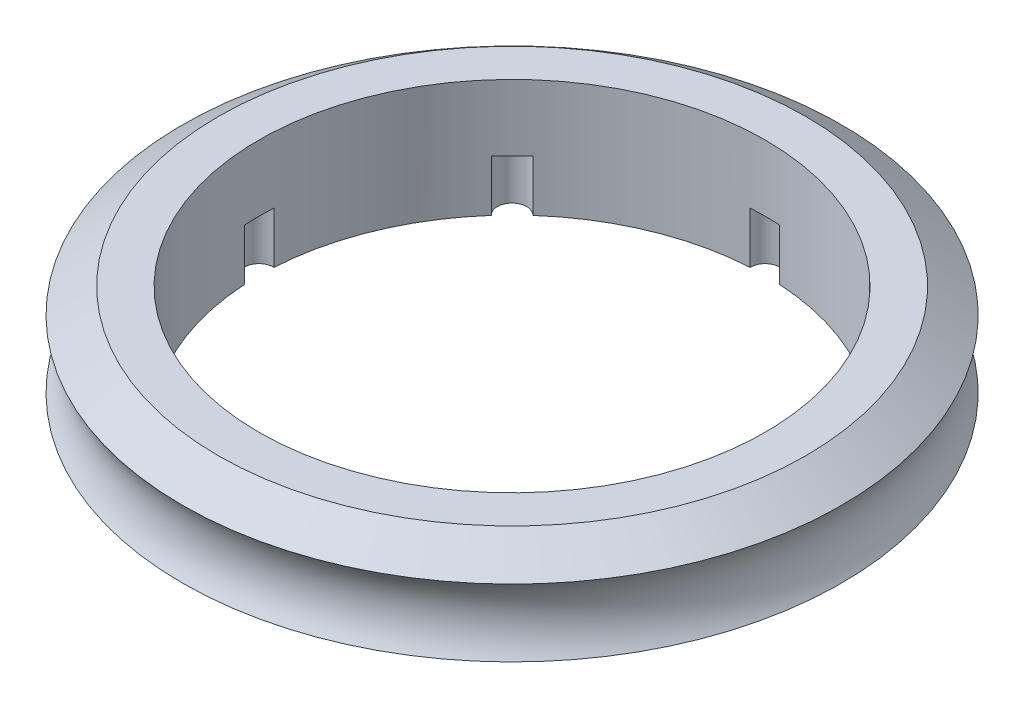
ISO-10303-21;
HEADER;
FILE_DESCRIPTION(('STEP AP214'),'2;1');
FILE_NAME('part.step','',(''),(''),'','','');
FILE_SCHEMA(('AUTOMOTIVE_DESIGN { 1 0 10303 214 1 1 1 1 }'));
ENDSEC;
DATA;
#1=APPLICATION_CONTEXT('core data for automotive mechanical design processes');
#2=APPLICATION_PROTOCOL_DEFINITION('international standard','automotive_design',2000,#1);
#3=PRODUCT_CONTEXT('',#1,'mechanical');
#4=PRODUCT('Part','Part','',(#3));
#5=PRODUCT_RELATED_PRODUCT_CATEGORY('part','',(#4));
#6=PRODUCT_DEFINITION_FORMATION('','',#4);
#7=PRODUCT_DEFINITION_CONTEXT('part definition',#1,'design');
#8=PRODUCT_DEFINITION('design','',#6,#7);
#9=PRODUCT_DEFINITION_SHAPE('','',#8);
#10=(LENGTH_UNIT() NAMED_UNIT(*) SI_UNIT(.MILLI.,.METRE.));
#11=(NAMED_UNIT(*) PLANE_ANGLE_UNIT() SI_UNIT($,.RADIAN.));
#12=(NAMED_UNIT(*) SI_UNIT($,.STERADIAN.) SOLID_ANGLE_UNIT());
#13=UNCERTAINTY_MEASURE_WITH_UNIT(LENGTH_MEASURE(1.E-05),#10,'distance_accuracy_value','');
#14=(GEOMETRIC_REPRESENTATION_CONTEXT(3) GLOBAL_UNCERTAINTY_ASSIGNED_CONTEXT((#13)) GLOBAL_UNIT_ASSIGNED_CONTEXT((#10,
#11,#12)) REPRESENTATION_CONTEXT('',''));
#15=CARTESIAN_POINT('',(0.,0.,0.));
#16=DIRECTION('',(0.,0.,1.));
#17=DIRECTION('',(1.,0.,0.));
#18=AXIS2_PLACEMENT_3D('',#15,#16,#17);
#19=CARTESIAN_POINT('',(0.,24.7732649319945,0.));
#20=DIRECTION('',(0.,1.,0.));
#21=DIRECTION('',(0.,0.,1.));
#22=AXIS2_PLACEMENT_3D('',#19,#20,#21);
#23=CYLINDRICAL_SURFACE('',#22,68.94);
#24=CARTESIAN_POINT('',(0.,32.,0.));
#25=DIRECTION('',(0.,1.,0.));
#26=DIRECTION('',(0.,0.,1.));
#27=AXIS2_PLACEMENT_3D('',#24,#25,#26);
#28=CIRCLE('',#27,68.94);
#29=CARTESIAN_POINT('',(0.,32.,68.94));
#30=VERTEX_POINT('',#29);
#31=EDGE_CURVE('E190',#30,#30,#28,.T.);
#32=ORIENTED_EDGE('',*,*,#31,.T.);
#33=EDGE_LOOP('',(#32));
#34=FACE_BOUND('',#33,.T.);
#35=DIRECTION('',(0.,-1.,0.));
#36=VECTOR('',#35,1.);
#37=CARTESIAN_POINT('',(-3.99831640031537,7.,-68.8239570641137));
#38=LINE('',#37,#36);
#39=CARTESIAN_POINT('',(-3.99831640031537,14.,-68.8239570641137));
#40=VERTEX_POINT('',#39);
#41=CARTESIAN_POINT('',(-3.99831640031537,0.,-68.8239570641137));
#42=VERTEX_POINT('',#41);
#43=EDGE_CURVE('E11',#40,#42,#38,.T.);
#44=ORIENTED_EDGE('',*,*,#43,.F.);
#45=CARTESIAN_POINT('',(0.,14.,0.));
#46=DIRECTION('',(0.,1.,0.));
#47=DIRECTION('',(0.,0.,1.));
#48=AXIS2_PLACEMENT_3D('',#45,#46,#47);
#49=CIRCLE('',#48,68.94);
#50=CARTESIAN_POINT('',(3.99831640031537,14.,-68.8239570641137));
#51=VERTEX_POINT('',#50);
#52=EDGE_CURVE('E282',#40,#51,#49,.F.);
#53=ORIENTED_EDGE('',*,*,#52,.T.);
#54=DIRECTION('',(0.,-1.,0.));
#55=VECTOR('',#54,1.);
#56=CARTESIAN_POINT('',(3.99831640031537,7.,-68.8239570641137));
#57=LINE('',#56,#55);
#58=CARTESIAN_POINT('',(3.99831640031537,0.,-68.8239570641137));
#59=VERTEX_POINT('',#58);
#60=EDGE_CURVE('E48',#59,#51,#57,.F.);
#61=ORIENTED_EDGE('',*,*,#60,.F.);
#62=CARTESIAN_POINT('',(0.,0.,0.));
#63=DIRECTION('',(0.,1.,0.));
#64=DIRECTION('',(0.,0.,1.));
#65=AXIS2_PLACEMENT_3D('',#62,#63,#64);
#66=CIRCLE('',#65,68.94);
#67=CARTESIAN_POINT('',(45.8386501081343,0.,-51.4931233881189));
#68=VERTEX_POINT('',#67);
#69=EDGE_CURVE('E179',#68,#59,#66,.T.);
#70=ORIENTED_EDGE('',*,*,#69,.F.);
#71=DIRECTION('',(0.,-1.,0.));
#72=VECTOR('',#71,1.);
#73=CARTESIAN_POINT('',(45.8386501081343,7.,-51.4931233881189));
#74=LINE('',#73,#72);
#75=CARTESIAN_POINT('',(45.8386501081343,14.,-51.4931233881189));
#76=VERTEX_POINT('',#75);
#77=EDGE_CURVE('E279',#76,#68,#74,.T.);
#78=ORIENTED_EDGE('',*,*,#77,.F.);
#79=CARTESIAN_POINT('',(0.,14.,0.));
#80=DIRECTION('',(0.,1.,0.));
#81=DIRECTION('',(0.,0.,1.));
#82=AXIS2_PLACEMENT_3D('',#79,#80,#81);
#83=CIRCLE('',#82,68.94);
#84=CARTESIAN_POINT('',(51.4931233881191,14.,-45.8386501081341));
#85=VERTEX_POINT('',#84);
#86=EDGE_CURVE('E272',#76,#85,#83,.F.);
#87=ORIENTED_EDGE('',*,*,#86,.T.);
#88=DIRECTION('',(0.,-1.,0.));
#89=VECTOR('',#88,1.);
#90=CARTESIAN_POINT('',(51.4931233881191,7.,-45.8386501081341));
#91=LINE('',#90,#89);
#92=CARTESIAN_POINT('',(51.4931233881191,0.,-45.8386501081341));
#93=VERTEX_POINT('',#92);
#94=EDGE_CURVE('E276',#93,#85,#91,.F.);
#95=ORIENTED_EDGE('',*,*,#94,.F.);
#96=CARTESIAN_POINT('',(68.8239570641137,0.,-3.99831640031513));
#97=VERTEX_POINT('',#96);
#98=EDGE_CURVE('E184',#97,#93,#66,.T.);
#99=ORIENTED_EDGE('',*,*,#98,.F.);
#100=DIRECTION('',(0.,-1.,0.));
#101=VECTOR('',#100,1.);
#102=CARTESIAN_POINT('',(68.8239570641137,7.,-3.99831640031513));
#103=LINE('',#102,#101);
#104=CARTESIAN_POINT('',(68.8239570641137,14.,-3.99831640031513));
#105=VERTEX_POINT('',#104);
#106=EDGE_CURVE('E269',#105,#97,#103,.T.);
#107=ORIENTED_EDGE('',*,*,#106,.F.);
#108=CARTESIAN_POINT('',(0.,14.,0.));
#109=DIRECTION('',(0.,1.,0.));
#110=DIRECTION('',(0.,0.,1.));
#111=AXIS2_PLACEMENT_3D('',#108,#109,#110);
#112=CIRCLE('',#111,68.94);
#113=CARTESIAN_POINT('',(68.8239570641137,14.,3.99831640031561));
#114=VERTEX_POINT('',#113);
#115=EDGE_CURVE('E261',#105,#114,#112,.F.);
#116=ORIENTED_EDGE('',*,*,#115,.T.);
#117=DIRECTION('',(0.,-1.,0.));
#118=VECTOR('',#117,1.);
#119=CARTESIAN_POINT('',(68.8239570641137,7.,3.99831640031561));
#120=LINE('',#119,#118);
#121=CARTESIAN_POINT('',(68.8239570641137,0.,3.99831640031561));
#122=VERTEX_POINT('',#121);
#123=EDGE_CURVE('E265',#122,#114,#120,.F.);
#124=ORIENTED_EDGE('',*,*,#123,.F.);
#125=CARTESIAN_POINT('',(51.4931233881188,0.,45.8386501081345));
#126=VERTEX_POINT('',#125);
#127=EDGE_CURVE('E191',#126,#122,#66,.T.);
#128=ORIENTED_EDGE('',*,*,#127,.F.);
#129=DIRECTION('',(0.,-1.,0.));
#130=VECTOR('',#129,1.);
#131=CARTESIAN_POINT('',(51.4931233881188,7.,45.8386501081345));
#132=LINE('',#131,#130);
#133=CARTESIAN_POINT('',(51.4931233881188,14.,45.8386501081345));
#134=VERTEX_POINT('',#133);
#135=EDGE_CURVE('E258',#134,#126,#132,.T.);
#136=ORIENTED_EDGE('',*,*,#135,.F.);
#137=CARTESIAN_POINT('',(0.,14.,0.));
#138=DIRECTION('',(0.,1.,0.));
#139=DIRECTION('',(0.,0.,1.));
#140=AXIS2_PLACEMENT_3D('',#137,#138,#139);
#141=CIRCLE('',#140,68.94);
#142=CARTESIAN_POINT('',(45.8386501081339,14.,51.4931233881192));
#143=VERTEX_POINT('',#142);
#144=EDGE_CURVE('E250',#134,#143,#141,.F.);
#145=ORIENTED_EDGE('',*,*,#144,.T.);
#146=DIRECTION('',(0.,-1.,0.));
#147=VECTOR('',#146,1.);
#148=CARTESIAN_POINT('',(45.8386501081339,7.,51.4931233881192));
#149=LINE('',#148,#147);
#150=CARTESIAN_POINT('',(45.8386501081339,0.,51.4931233881192));
#151=VERTEX_POINT('',#150);
#152=EDGE_CURVE('E254',#151,#143,#149,.F.);
#153=ORIENTED_EDGE('',*,*,#152,.F.);
#154=CARTESIAN_POINT('',(3.99831640031489,0.,68.8239570641138));
#155=VERTEX_POINT('',#154);
#156=EDGE_CURVE('E186',#155,#151,#66,.T.);
#157=ORIENTED_EDGE('',*,*,#156,.F.);
#158=DIRECTION('',(0.,-1.,0.));
#159=VECTOR('',#158,1.);
#160=CARTESIAN_POINT('',(3.99831640031489,7.,68.8239570641138));
#161=LINE('',#160,#159);
#162=CARTESIAN_POINT('',(3.99831640031489,14.,68.8239570641138));
#163=VERTEX_POINT('',#162);
#164=EDGE_CURVE('E247',#163,#155,#161,.T.);
#165=ORIENTED_EDGE('',*,*,#164,.F.);
#166=CARTESIAN_POINT('',(0.,14.,0.));
#167=DIRECTION('',(0.,1.,0.));
#168=DIRECTION('',(0.,0.,1.));
#169=AXIS2_PLACEMENT_3D('',#166,#167,#168);
#170=CIRCLE('',#169,68.94);
#171=CARTESIAN_POINT('',(-3.99831640031586,14.,68.8239570641137));
#172=VERTEX_POINT('',#171);
#173=EDGE_CURVE('E239',#163,#172,#170,.F.);
#174=ORIENTED_EDGE('',*,*,#173,.T.);
#175=DIRECTION('',(0.,-1.,0.));
#176=VECTOR('',#175,1.);
#177=CARTESIAN_POINT('',(-3.99831640031586,7.,68.8239570641137));
#178=LINE('',#177,#176);
#179=CARTESIAN_POINT('',(-3.99831640031586,0.,68.8239570641137));
#180=VERTEX_POINT('',#179);
#181=EDGE_CURVE('E243',#180,#172,#178,.F.);
#182=ORIENTED_EDGE('',*,*,#181,.F.);
#183=CARTESIAN_POINT('',(-45.8386501081347,0.,51.4931233881186));
#184=VERTEX_POINT('',#183);
#185=EDGE_CURVE('E192',#184,#180,#66,.T.);
#186=ORIENTED_EDGE('',*,*,#185,.F.);
#187=DIRECTION('',(0.,-1.,0.));
#188=VECTOR('',#187,1.);
#189=CARTESIAN_POINT('',(-45.8386501081347,7.,51.4931233881186));
#190=LINE('',#189,#188);
#191=CARTESIAN_POINT('',(-45.8386501081347,14.,51.4931233881186));
#192=VERTEX_POINT('',#191);
#193=EDGE_CURVE('E236',#192,#184,#190,.T.);
#194=ORIENTED_EDGE('',*,*,#193,.F.);
#195=CARTESIAN_POINT('',(0.,14.,0.));
#196=DIRECTION('',(0.,1.,0.));
#197=DIRECTION('',(0.,0.,1.));
#198=AXIS2_PLACEMENT_3D('',#195,#196,#197);
#199=CIRCLE('',#198,68.94);
#200=CARTESIAN_POINT('',(-51.4931233881194,14.,45.8386501081338));
#201=VERTEX_POINT('',#200);
#202=EDGE_CURVE('E228',#192,#201,#199,.F.);
#203=ORIENTED_EDGE('',*,*,#202,.T.);
#204=DIRECTION('',(0.,-1.,0.));
#205=VECTOR('',#204,1.);
#206=CARTESIAN_POINT('',(-51.4931233881194,7.,45.8386501081338));
#207=LINE('',#206,#205);
#208=CARTESIAN_POINT('',(-51.4931233881194,0.,45.8386501081338));
#209=VERTEX_POINT('',#208);
#210=EDGE_CURVE('E232',#209,#201,#207,.F.);
#211=ORIENTED_EDGE('',*,*,#210,.F.);
#212=CARTESIAN_POINT('',(-68.8239570641138,0.,3.99831640031465));
#213=VERTEX_POINT('',#212);
#214=EDGE_CURVE('E185',#213,#209,#66,.T.);
#215=ORIENTED_EDGE('',*,*,#214,.F.);
#216=DIRECTION('',(0.,-1.,0.));
#217=VECTOR('',#216,1.);
#218=CARTESIAN_POINT('',(-68.8239570641138,7.,3.99831640031465));
#219=LINE('',#218,#217);
#220=CARTESIAN_POINT('',(-68.8239570641138,14.,3.99831640031465));
#221=VERTEX_POINT('',#220);
#222=EDGE_CURVE('E225',#221,#213,#219,.T.);
#223=ORIENTED_EDGE('',*,*,#222,.F.);
#224=CARTESIAN_POINT('',(0.,14.,0.));
#225=DIRECTION('',(0.,1.,0.));
#226=DIRECTION('',(0.,0.,1.));
#227=AXIS2_PLACEMENT_3D('',#224,#225,#226);
#228=CIRCLE('',#227,68.94);
#229=CARTESIAN_POINT('',(-68.8239570641137,14.,-3.9983164003161));
#230=VERTEX_POINT('',#229);
#231=EDGE_CURVE('E217',#221,#230,#228,.F.);
#232=ORIENTED_EDGE('',*,*,#231,.T.);
#233=DIRECTION('',(0.,-1.,0.));
#234=VECTOR('',#233,1.);
#235=CARTESIAN_POINT('',(-68.8239570641137,7.,-3.9983164003161));
#236=LINE('',#235,#234);
#237=CARTESIAN_POINT('',(-68.8239570641137,0.,-3.9983164003161));
#238=VERTEX_POINT('',#237);
#239=EDGE_CURVE('E221',#238,#230,#236,.F.);
#240=ORIENTED_EDGE('',*,*,#239,.F.);
#241=CARTESIAN_POINT('',(-51.4931233881184,0.,-45.8386501081348));
#242=VERTEX_POINT('',#241);
#243=EDGE_CURVE('E180',#242,#238,#66,.T.);
#244=ORIENTED_EDGE('',*,*,#243,.F.);
#245=DIRECTION('',(0.,-1.,0.));
#246=VECTOR('',#245,1.);
#247=CARTESIAN_POINT('',(-51.4931233881184,7.,-45.8386501081349));
#248=LINE('',#247,#246);
#249=CARTESIAN_POINT('',(-51.4931233881184,14.,-45.8386501081348));
#250=VERTEX_POINT('',#249);
#251=EDGE_CURVE('E159',#250,#242,#248,.T.);
#252=ORIENTED_EDGE('',*,*,#251,.F.);
#253=CARTESIAN_POINT('',(0.,14.,0.));
#254=DIRECTION('',(0.,1.,0.));
#255=DIRECTION('',(0.,0.,1.));
#256=AXIS2_PLACEMENT_3D('',#253,#254,#255);
#257=CIRCLE('',#256,68.94);
#258=CARTESIAN_POINT('',(-45.8386501081336,14.,-51.4931233881195));
#259=VERTEX_POINT('',#258);
#260=EDGE_CURVE('E171',#250,#259,#257,.F.);
#261=ORIENTED_EDGE('',*,*,#260,.T.);
#262=DIRECTION('',(0.,-1.,0.));
#263=VECTOR('',#262,1.);
#264=CARTESIAN_POINT('',(-45.8386501081336,7.,-51.4931233881196));
#265=LINE('',#264,#263);
#266=CARTESIAN_POINT('',(-45.8386501081336,0.,-51.4931233881195));
#267=VERTEX_POINT('',#266);
#268=EDGE_CURVE('E156',#267,#259,#265,.F.);
#269=ORIENTED_EDGE('',*,*,#268,.F.);
#270=EDGE_CURVE('E170',#42,#267,#66,.T.);
#271=ORIENTED_EDGE('',*,*,#270,.F.);
#272=EDGE_LOOP('',(#44,#53,#61,#70,#78,#87,#95,#99,#107,#116,#124,#128,#136,#145,#153,#157,#165,
#174,#182,#186,#194,#203,#211,#215,#223,#232,#240,#244,#252,#261,#269,#271));
#273=FACE_BOUND('',#272,.T.);
#274=ADVANCED_FACE('F39',(#34,#273),#23,.F.);
#275=CARTESIAN_POINT('',(0.,0.,-80.));
#276=DIRECTION('',(0.,1.,0.));
#277=DIRECTION('',(0.,0.,1.));
#278=AXIS2_PLACEMENT_3D('',#275,#276,#277);
#279=PLANE('',#278);
#280=CARTESIAN_POINT('',(0.,0.,-68.94));
#281=DIRECTION('',(0.,1.,0.));
#282=DIRECTION('',(0.,0.,1.));
#283=AXIS2_PLACEMENT_3D('',#280,#281,#282);
#284=CIRCLE('',#283,4.);
#285=EDGE_CURVE('E177',#59,#42,#284,.T.);
#286=ORIENTED_EDGE('',*,*,#285,.T.);
#287=ORIENTED_EDGE('',*,*,#270,.T.);
#288=CARTESIAN_POINT('',(-48.747941495,0.,-48.7479414950012));
#289=DIRECTION('',(0.,1.,0.));
#290=DIRECTION('',(0.,0.,1.));
#291=AXIS2_PLACEMENT_3D('',#288,#289,#290);
#292=CIRCLE('',#291,4.);
#293=EDGE_CURVE('E152',#267,#242,#292,.T.);
#294=ORIENTED_EDGE('',*,*,#293,.T.);
#295=ORIENTED_EDGE('',*,*,#243,.T.);
#296=CARTESIAN_POINT('',(-68.94,0.,-7.22108170499537E-13));
#297=DIRECTION('',(0.,1.,0.));
#298=DIRECTION('',(0.,0.,1.));
#299=AXIS2_PLACEMENT_3D('',#296,#297,#298);
#300=CIRCLE('',#299,4.);
#301=EDGE_CURVE('E551',#238,#213,#300,.T.);
#302=ORIENTED_EDGE('',*,*,#301,.T.);
#303=ORIENTED_EDGE('',*,*,#214,.T.);
#304=CARTESIAN_POINT('',(-48.747941495001,0.,48.7479414950002));
#305=DIRECTION('',(0.,1.,0.));
#306=DIRECTION('',(0.,0.,1.));
#307=AXIS2_PLACEMENT_3D('',#304,#305,#306);
#308=CIRCLE('',#307,4.00000000000001);
#309=EDGE_CURVE('E543',#209,#184,#308,.T.);
#310=ORIENTED_EDGE('',*,*,#309,.T.);
#311=ORIENTED_EDGE('',*,*,#185,.T.);
#312=CARTESIAN_POINT('',(-4.81405446999691E-13,0.,68.94));
#313=DIRECTION('',(0.,1.,0.));
#314=DIRECTION('',(0.,0.,1.));
#315=AXIS2_PLACEMENT_3D('',#312,#313,#314);
#316=CIRCLE('',#315,4.);
#317=EDGE_CURVE('E535',#180,#155,#316,.T.);
#318=ORIENTED_EDGE('',*,*,#317,.T.);
#319=ORIENTED_EDGE('',*,*,#156,.T.);
#320=CARTESIAN_POINT('',(48.7479414950003,0.,48.7479414950009));
#321=DIRECTION('',(0.,1.,0.));
#322=DIRECTION('',(0.,0.,1.));
#323=AXIS2_PLACEMENT_3D('',#320,#321,#322);
#324=CIRCLE('',#323,4.);
#325=EDGE_CURVE('E527',#151,#126,#324,.T.);
#326=ORIENTED_EDGE('',*,*,#325,.T.);
#327=ORIENTED_EDGE('',*,*,#127,.T.);
#328=CARTESIAN_POINT('',(68.94,0.,2.40702723499846E-13));
#329=DIRECTION('',(0.,1.,0.));
#330=DIRECTION('',(0.,0.,1.));
#331=AXIS2_PLACEMENT_3D('',#328,#329,#330);
#332=CIRCLE('',#331,4.);
#333=EDGE_CURVE('E517',#122,#97,#332,.T.);
#334=ORIENTED_EDGE('',*,*,#333,.T.);
#335=ORIENTED_EDGE('',*,*,#98,.T.);
#336=CARTESIAN_POINT('',(48.7479414950007,0.,-48.7479414950005));
#337=DIRECTION('',(0.,1.,0.));
#338=DIRECTION('',(0.,0.,1.));
#339=AXIS2_PLACEMENT_3D('',#336,#337,#338);
#340=CIRCLE('',#339,4.);
#341=EDGE_CURVE('E505',#93,#68,#340,.T.);
#342=ORIENTED_EDGE('',*,*,#341,.T.);
#343=ORIENTED_EDGE('',*,*,#69,.T.);
#344=EDGE_LOOP('',(#286,#287,#294,#295,#302,#303,#310,#311,#318,#319,#326,#327,#334,#335,#342,#343));
#345=FACE_BOUND('',#344,.T.);
#346=CARTESIAN_POINT('',(0.,0.,0.));
#347=DIRECTION('',(0.,1.,0.));
#348=DIRECTION('',(0.,0.,1.));
#349=AXIS2_PLACEMENT_3D('',#346,#347,#348);
#350=CIRCLE('',#349,80.);
#351=CARTESIAN_POINT('',(0.,0.,80.));
#352=VERTEX_POINT('',#351);
#353=EDGE_CURVE('E209',#352,#352,#350,.T.);
#354=ORIENTED_EDGE('',*,*,#353,.F.);
#355=EDGE_LOOP('',(#354));
#356=FACE_BOUND('',#355,.T.);
#357=ADVANCED_FACE('F41',(#345,#356),#279,.F.);
#358=CARTESIAN_POINT('',(0.,0.,0.));
#359=DIRECTION('',(0.,1.,0.));
#360=DIRECTION('',(0.,0.,1.));
#361=AXIS2_PLACEMENT_3D('',#358,#359,#360);
#362=CONICAL_SURFACE('',#361,80.,0.959931088596883);
#363=CARTESIAN_POINT('',(0.,6.8227770183833,0.));
#364=DIRECTION('',(0.,1.,0.));
#365=DIRECTION('',(0.,0.,1.));
#366=AXIS2_PLACEMENT_3D('',#363,#364,#365);
#367=CIRCLE('',#366,89.7439353992501);
#368=CARTESIAN_POINT('',(0.,6.8227770183833,89.7439353992501));
#369=VERTEX_POINT('',#368);
#370=EDGE_CURVE('E205',#369,#369,#367,.T.);
#371=ORIENTED_EDGE('',*,*,#370,.F.);
#372=EDGE_LOOP('',(#371));
#373=FACE_BOUND('',#372,.T.);
#374=ORIENTED_EDGE('',*,*,#353,.T.);
#375=EDGE_LOOP('',(#374));
#376=FACE_BOUND('',#375,.T.);
#377=ADVANCED_FACE('F304',(#373,#376),#362,.T.);
#378=CARTESIAN_POINT('',(0.,16.,0.));
#379=DIRECTION('',(0.,1.,0.));
#380=DIRECTION('',(0.,0.,1.));
#381=AXIS2_PLACEMENT_3D('',#378,#379,#380);
#382=TOROIDAL_SURFACE('',#381,102.850368107874,16.);
#383=CARTESIAN_POINT('',(0.,25.1772229816167,0.));
#384=DIRECTION('',(0.,1.,0.));
#385=DIRECTION('',(0.,0.,1.));
#386=AXIS2_PLACEMENT_3D('',#383,#384,#385);
#387=CIRCLE('',#386,89.7439353992501);
#388=CARTESIAN_POINT('',(0.,25.1772229816167,89.7439353992501));
#389=VERTEX_POINT('',#388);
#390=EDGE_CURVE('E201',#389,#389,#387,.T.);
#391=ORIENTED_EDGE('',*,*,#390,.F.);
#392=EDGE_LOOP('',(#391));
#393=FACE_BOUND('',#392,.T.);
#394=ORIENTED_EDGE('',*,*,#370,.T.);
#395=EDGE_LOOP('',(#394));
#396=FACE_BOUND('',#395,.T.);
#397=ADVANCED_FACE('F315',(#393,#396),#382,.F.);
#398=CARTESIAN_POINT('',(0.,25.1772229816167,0.));
#399=DIRECTION('',(0.,-1.,0.));
#400=DIRECTION('',(0.,0.,-1.));
#401=AXIS2_PLACEMENT_3D('',#398,#399,#400);
#402=CONICAL_SURFACE('',#401,89.7439353992501,0.959931088596884);
#403=CARTESIAN_POINT('',(0.,32.,0.));
#404=DIRECTION('',(0.,1.,0.));
#405=DIRECTION('',(0.,0.,1.));
#406=AXIS2_PLACEMENT_3D('',#403,#404,#405);
#407=CIRCLE('',#406,80.);
#408=CARTESIAN_POINT('',(0.,32.,80.));
#409=VERTEX_POINT('',#408);
#410=EDGE_CURVE('E197',#409,#409,#407,.T.);
#411=ORIENTED_EDGE('',*,*,#410,.F.);
#412=EDGE_LOOP('',(#411));
#413=FACE_BOUND('',#412,.T.);
#414=ORIENTED_EDGE('',*,*,#390,.T.);
#415=EDGE_LOOP('',(#414));
#416=FACE_BOUND('',#415,.T.);
#417=ADVANCED_FACE('F311',(#413,#416),#402,.T.);
#418=CARTESIAN_POINT('',(0.,32.,-68.94));
#419=DIRECTION('',(0.,-1.,0.));
#420=DIRECTION('',(0.,0.,-1.));
#421=AXIS2_PLACEMENT_3D('',#418,#419,#420);
#422=PLANE('',#421);
#423=ORIENTED_EDGE('',*,*,#31,.F.);
#424=EDGE_LOOP('',(#423));
#425=FACE_BOUND('',#424,.T.);
#426=ORIENTED_EDGE('',*,*,#410,.T.);
#427=EDGE_LOOP('',(#426));
#428=FACE_BOUND('',#427,.T.);
#429=ADVANCED_FACE('F308',(#425,#428),#422,.F.);
#430=CARTESIAN_POINT('',(-48.747941495,14.,-48.7479414950012));
#431=DIRECTION('',(0.,-1.,0.));
#432=DIRECTION('',(0.,0.,-1.));
#433=AXIS2_PLACEMENT_3D('',#430,#431,#432);
#434=CYLINDRICAL_SURFACE('',#433,4.);
#435=ORIENTED_EDGE('',*,*,#251,.T.);
#436=ORIENTED_EDGE('',*,*,#293,.F.);
#437=ORIENTED_EDGE('',*,*,#268,.T.);
#438=CARTESIAN_POINT('',(-48.747941495,14.,-48.7479414950012));
#439=DIRECTION('',(0.,1.,0.));
#440=DIRECTION('',(0.,0.,1.));
#441=AXIS2_PLACEMENT_3D('',#438,#439,#440);
#442=CIRCLE('',#441,4.);
#443=EDGE_CURVE('E165',#259,#250,#442,.T.);
#444=ORIENTED_EDGE('',*,*,#443,.T.);
#445=EDGE_LOOP('',(#435,#436,#437,#444));
#446=FACE_BOUND('',#445,.T.);
#447=ADVANCED_FACE('F154',(#446),#434,.F.);
#448=CARTESIAN_POINT('',(-48.747941495,14.,-48.7479414950012));
#449=DIRECTION('',(0.,1.,0.));
#450=DIRECTION('',(0.,0.,1.));
#451=AXIS2_PLACEMENT_3D('',#448,#449,#450);
#452=PLANE('',#451);
#453=ORIENTED_EDGE('',*,*,#443,.F.);
#454=ORIENTED_EDGE('',*,*,#260,.F.);
#455=EDGE_LOOP('',(#453,#454));
#456=FACE_BOUND('',#455,.T.);
#457=ADVANCED_FACE('F347',(#456),#452,.F.);
#458=CARTESIAN_POINT('',(-68.94,14.,-7.22108170499537E-13));
#459=DIRECTION('',(0.,-1.,0.));
#460=DIRECTION('',(0.,0.,-1.));
#461=AXIS2_PLACEMENT_3D('',#458,#459,#460);
#462=CYLINDRICAL_SURFACE('',#461,4.);
#463=ORIENTED_EDGE('',*,*,#222,.T.);
#464=ORIENTED_EDGE('',*,*,#301,.F.);
#465=ORIENTED_EDGE('',*,*,#239,.T.);
#466=CARTESIAN_POINT('',(-68.94,14.,-7.22108170499537E-13));
#467=DIRECTION('',(0.,1.,0.));
#468=DIRECTION('',(0.,0.,1.));
#469=AXIS2_PLACEMENT_3D('',#466,#467,#468);
#470=CIRCLE('',#469,4.);
#471=EDGE_CURVE('E547',#230,#221,#470,.T.);
#472=ORIENTED_EDGE('',*,*,#471,.T.);
#473=EDGE_LOOP('',(#463,#464,#465,#472));
#474=FACE_BOUND('',#473,.T.);
#475=ADVANCED_FACE('F353',(#474),#462,.F.);
#476=CARTESIAN_POINT('',(-68.94,14.,-7.22108170499537E-13));
#477=DIRECTION('',(0.,1.,0.));
#478=DIRECTION('',(0.,0.,1.));
#479=AXIS2_PLACEMENT_3D('',#476,#477,#478);
#480=PLANE('',#479);
#481=ORIENTED_EDGE('',*,*,#471,.F.);
#482=ORIENTED_EDGE('',*,*,#231,.F.);
#483=EDGE_LOOP('',(#481,#482));
#484=FACE_BOUND('',#483,.T.);
#485=ADVANCED_FACE('F360',(#484),#480,.F.);
#486=CARTESIAN_POINT('',(-48.747941495001,14.,48.7479414950002));
#487=DIRECTION('',(0.,-1.,0.));
#488=DIRECTION('',(0.,0.,-1.));
#489=AXIS2_PLACEMENT_3D('',#486,#487,#488);
#490=CYLINDRICAL_SURFACE('',#489,4.00000000000001);
#491=ORIENTED_EDGE('',*,*,#193,.T.);
#492=ORIENTED_EDGE('',*,*,#309,.F.);
#493=ORIENTED_EDGE('',*,*,#210,.T.);
#494=CARTESIAN_POINT('',(-48.747941495001,14.,48.7479414950002));
#495=DIRECTION('',(0.,1.,0.));
#496=DIRECTION('',(0.,0.,1.));
#497=AXIS2_PLACEMENT_3D('',#494,#495,#496);
#498=CIRCLE('',#497,4.00000000000001);
#499=EDGE_CURVE('E539',#201,#192,#498,.T.);
#500=ORIENTED_EDGE('',*,*,#499,.T.);
#501=EDGE_LOOP('',(#491,#492,#493,#500));
#502=FACE_BOUND('',#501,.T.);
#503=ADVANCED_FACE('F368',(#502),#490,.F.);
#504=CARTESIAN_POINT('',(-48.747941495001,14.,48.7479414950002));
#505=DIRECTION('',(0.,1.,0.));
#506=DIRECTION('',(0.,0.,1.));
#507=AXIS2_PLACEMENT_3D('',#504,#505,#506);
#508=PLANE('',#507);
#509=ORIENTED_EDGE('',*,*,#499,.F.);
#510=ORIENTED_EDGE('',*,*,#202,.F.);
#511=EDGE_LOOP('',(#509,#510));
#512=FACE_BOUND('',#511,.T.);
#513=ADVANCED_FACE('F376',(#512),#508,.F.);
#514=CARTESIAN_POINT('',(-4.81405446999691E-13,14.,68.94));
#515=DIRECTION('',(0.,-1.,0.));
#516=DIRECTION('',(0.,0.,-1.));
#517=AXIS2_PLACEMENT_3D('',#514,#515,#516);
#518=CYLINDRICAL_SURFACE('',#517,4.);
#519=ORIENTED_EDGE('',*,*,#164,.T.);
#520=ORIENTED_EDGE('',*,*,#317,.F.);
#521=ORIENTED_EDGE('',*,*,#181,.T.);
#522=CARTESIAN_POINT('',(-4.81405446999691E-13,14.,68.94));
#523=DIRECTION('',(0.,1.,0.));
#524=DIRECTION('',(0.,0.,1.));
#525=AXIS2_PLACEMENT_3D('',#522,#523,#524);
#526=CIRCLE('',#525,4.);
#527=EDGE_CURVE('E531',#172,#163,#526,.T.);
#528=ORIENTED_EDGE('',*,*,#527,.T.);
#529=EDGE_LOOP('',(#519,#520,#521,#528));
#530=FACE_BOUND('',#529,.T.);
#531=ADVANCED_FACE('F384',(#530),#518,.F.);
#532=CARTESIAN_POINT('',(-4.81405446999691E-13,14.,68.94));
#533=DIRECTION('',(0.,1.,0.));
#534=DIRECTION('',(0.,0.,1.));
#535=AXIS2_PLACEMENT_3D('',#532,#533,#534);
#536=PLANE('',#535);
#537=ORIENTED_EDGE('',*,*,#527,.F.);
#538=ORIENTED_EDGE('',*,*,#173,.F.);
#539=EDGE_LOOP('',(#537,#538));
#540=FACE_BOUND('',#539,.T.);
#541=ADVANCED_FACE('F392',(#540),#536,.F.);
#542=CARTESIAN_POINT('',(48.7479414950003,14.,48.7479414950009));
#543=DIRECTION('',(0.,-1.,0.));
#544=DIRECTION('',(0.,0.,-1.));
#545=AXIS2_PLACEMENT_3D('',#542,#543,#544);
#546=CYLINDRICAL_SURFACE('',#545,4.);
#547=ORIENTED_EDGE('',*,*,#135,.T.);
#548=ORIENTED_EDGE('',*,*,#325,.F.);
#549=ORIENTED_EDGE('',*,*,#152,.T.);
#550=CARTESIAN_POINT('',(48.7479414950003,14.,48.7479414950009));
#551=DIRECTION('',(0.,1.,0.));
#552=DIRECTION('',(0.,0.,1.));
#553=AXIS2_PLACEMENT_3D('',#550,#551,#552);
#554=CIRCLE('',#553,4.);
#555=EDGE_CURVE('E523',#143,#134,#554,.T.);
#556=ORIENTED_EDGE('',*,*,#555,.T.);
#557=EDGE_LOOP('',(#547,#548,#549,#556));
#558=FACE_BOUND('',#557,.T.);
#559=ADVANCED_FACE('F400',(#558),#546,.F.);
#560=CARTESIAN_POINT('',(48.7479414950003,14.,48.7479414950009));
#561=DIRECTION('',(0.,1.,0.));
#562=DIRECTION('',(0.,0.,1.));
#563=AXIS2_PLACEMENT_3D('',#560,#561,#562);
#564=PLANE('',#563);
#565=ORIENTED_EDGE('',*,*,#555,.F.);
#566=ORIENTED_EDGE('',*,*,#144,.F.);
#567=EDGE_LOOP('',(#565,#566));
#568=FACE_BOUND('',#567,.T.);
#569=ADVANCED_FACE('F408',(#568),#564,.F.);
#570=CARTESIAN_POINT('',(68.94,14.,2.40702723499846E-13));
#571=DIRECTION('',(0.,-1.,0.));
#572=DIRECTION('',(0.,0.,-1.));
#573=AXIS2_PLACEMENT_3D('',#570,#571,#572);
#574=CYLINDRICAL_SURFACE('',#573,4.);
#575=ORIENTED_EDGE('',*,*,#106,.T.);
#576=ORIENTED_EDGE('',*,*,#333,.F.);
#577=ORIENTED_EDGE('',*,*,#123,.T.);
#578=CARTESIAN_POINT('',(68.94,14.,2.40702723499846E-13));
#579=DIRECTION('',(0.,1.,0.));
#580=DIRECTION('',(0.,0.,1.));
#581=AXIS2_PLACEMENT_3D('',#578,#579,#580);
#582=CIRCLE('',#581,4.);
#583=EDGE_CURVE('E511',#114,#105,#582,.T.);
#584=ORIENTED_EDGE('',*,*,#583,.T.);
#585=EDGE_LOOP('',(#575,#576,#577,#584));
#586=FACE_BOUND('',#585,.T.);
#587=ADVANCED_FACE('F416',(#586),#574,.F.);
#588=CARTESIAN_POINT('',(68.94,14.,2.40702723499846E-13));
#589=DIRECTION('',(0.,1.,0.));
#590=DIRECTION('',(0.,0.,1.));
#591=AXIS2_PLACEMENT_3D('',#588,#589,#590);
#592=PLANE('',#591);
#593=ORIENTED_EDGE('',*,*,#583,.F.);
#594=ORIENTED_EDGE('',*,*,#115,.F.);
#595=EDGE_LOOP('',(#593,#594));
#596=FACE_BOUND('',#595,.T.);
#597=ADVANCED_FACE('F424',(#596),#592,.F.);
#598=CARTESIAN_POINT('',(48.7479414950007,14.,-48.7479414950005));
#599=DIRECTION('',(0.,-1.,0.));
#600=DIRECTION('',(0.,0.,-1.));
#601=AXIS2_PLACEMENT_3D('',#598,#599,#600);
#602=CYLINDRICAL_SURFACE('',#601,4.);
#603=ORIENTED_EDGE('',*,*,#77,.T.);
#604=ORIENTED_EDGE('',*,*,#341,.F.);
#605=ORIENTED_EDGE('',*,*,#94,.T.);
#606=CARTESIAN_POINT('',(48.7479414950007,14.,-48.7479414950005));
#607=DIRECTION('',(0.,1.,0.));
#608=DIRECTION('',(0.,0.,1.));
#609=AXIS2_PLACEMENT_3D('',#606,#607,#608);
#610=CIRCLE('',#609,4.);
#611=EDGE_CURVE('E61',#85,#76,#610,.T.);
#612=ORIENTED_EDGE('',*,*,#611,.T.);
#613=EDGE_LOOP('',(#603,#604,#605,#612));
#614=FACE_BOUND('',#613,.T.);
#615=ADVANCED_FACE('F432',(#614),#602,.F.);
#616=CARTESIAN_POINT('',(48.7479414950007,14.,-48.7479414950005));
#617=DIRECTION('',(0.,1.,0.));
#618=DIRECTION('',(0.,0.,1.));
#619=AXIS2_PLACEMENT_3D('',#616,#617,#618);
#620=PLANE('',#619);
#621=ORIENTED_EDGE('',*,*,#611,.F.);
#622=ORIENTED_EDGE('',*,*,#86,.F.);
#623=EDGE_LOOP('',(#621,#622));
#624=FACE_BOUND('',#623,.T.);
#625=ADVANCED_FACE('F296',(#624),#620,.F.);
#626=CARTESIAN_POINT('',(0.,14.,-68.94));
#627=DIRECTION('',(0.,-1.,0.));
#628=DIRECTION('',(0.,0.,-1.));
#629=AXIS2_PLACEMENT_3D('',#626,#627,#628);
#630=CYLINDRICAL_SURFACE('',#629,4.);
#631=ORIENTED_EDGE('',*,*,#43,.T.);
#632=ORIENTED_EDGE('',*,*,#285,.F.);
#633=ORIENTED_EDGE('',*,*,#60,.T.);
#634=CARTESIAN_POINT('',(0.,14.,-68.94));
#635=DIRECTION('',(0.,1.,0.));
#636=DIRECTION('',(0.,0.,1.));
#637=AXIS2_PLACEMENT_3D('',#634,#635,#636);
#638=CIRCLE('',#637,4.);
#639=EDGE_CURVE('E54',#51,#40,#638,.T.);
#640=ORIENTED_EDGE('',*,*,#639,.T.);
#641=EDGE_LOOP('',(#631,#632,#633,#640));
#642=FACE_BOUND('',#641,.T.);
#643=ADVANCED_FACE('F288',(#642),#630,.F.);
#644=CARTESIAN_POINT('',(0.,14.,-68.94));
#645=DIRECTION('',(0.,1.,0.));
#646=DIRECTION('',(0.,0.,1.));
#647=AXIS2_PLACEMENT_3D('',#644,#645,#646);
#648=PLANE('',#647);
#649=ORIENTED_EDGE('',*,*,#639,.F.);
#650=ORIENTED_EDGE('',*,*,#52,.F.);
#651=EDGE_LOOP('',(#649,#650));
#652=FACE_BOUND('',#651,.T.);
#653=ADVANCED_FACE('F290',(#652),#648,.F.);
#654=CLOSED_SHELL('',(#274,#357,#377,#397,#417,#429,#447,#457,#475,#485,#503,#513,#531,#541,
#559,#569,#587,#597,#615,#625,#643,#653));
#655=MANIFOLD_SOLID_BREP('B2',#654);
#656=ADVANCED_BREP_SHAPE_REPRESENTATION('',(#18,#655),#14);
#657=SHAPE_DEFINITION_REPRESENTATION(#9,#656);
ENDSEC;
END-ISO-10303-21;
